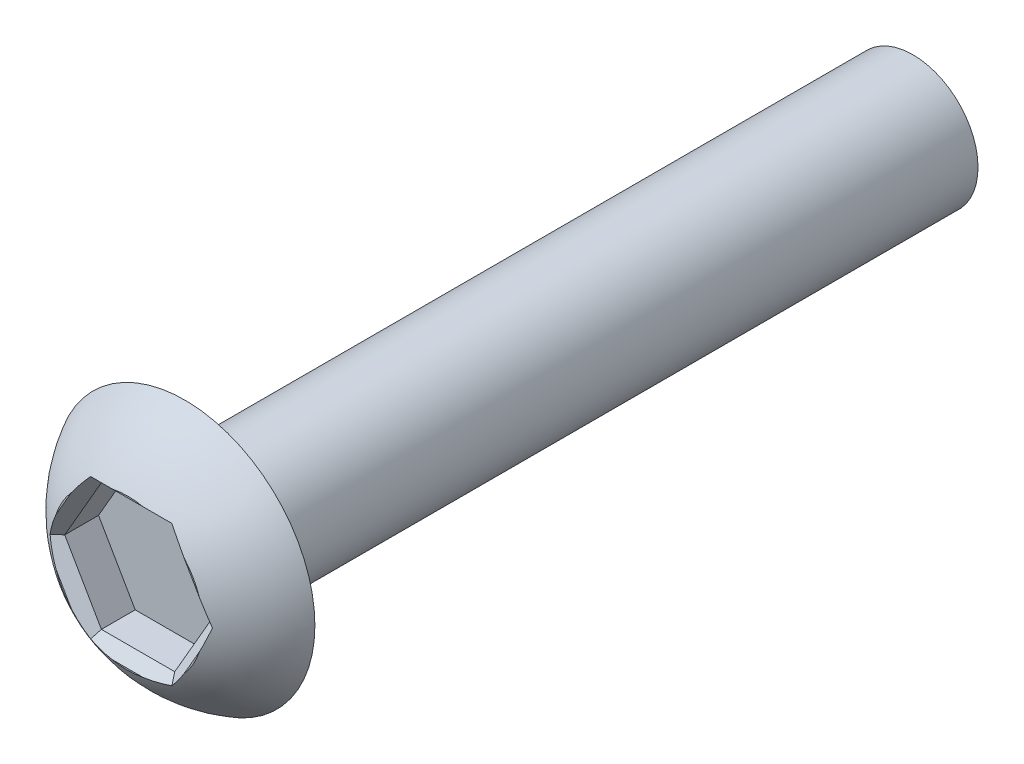
ISO-10303-21;
HEADER;
FILE_DESCRIPTION(('STEP AP214'),'2;1');
FILE_NAME('part.step','',(''),(''),'','','');
FILE_SCHEMA(('AUTOMOTIVE_DESIGN { 1 0 10303 214 1 1 1 1 }'));
ENDSEC;
DATA;
#1=APPLICATION_CONTEXT('core data for automotive mechanical design processes');
#2=APPLICATION_PROTOCOL_DEFINITION('international standard','automotive_design',2000,#1);
#3=PRODUCT_CONTEXT('',#1,'mechanical');
#4=PRODUCT('Part','Part','',(#3));
#5=PRODUCT_RELATED_PRODUCT_CATEGORY('part','',(#4));
#6=PRODUCT_DEFINITION_FORMATION('','',#4);
#7=PRODUCT_DEFINITION_CONTEXT('part definition',#1,'design');
#8=PRODUCT_DEFINITION('design','',#6,#7);
#9=PRODUCT_DEFINITION_SHAPE('','',#8);
#10=(LENGTH_UNIT() NAMED_UNIT(*) SI_UNIT(.MILLI.,.METRE.));
#11=(NAMED_UNIT(*) PLANE_ANGLE_UNIT() SI_UNIT($,.RADIAN.));
#12=(NAMED_UNIT(*) SI_UNIT($,.STERADIAN.) SOLID_ANGLE_UNIT());
#13=UNCERTAINTY_MEASURE_WITH_UNIT(LENGTH_MEASURE(1.E-05),#10,'distance_accuracy_value','');
#14=(GEOMETRIC_REPRESENTATION_CONTEXT(3) GLOBAL_UNCERTAINTY_ASSIGNED_CONTEXT((#13)) GLOBAL_UNIT_ASSIGNED_CONTEXT((#10,
#11,#12)) REPRESENTATION_CONTEXT('',''));
#15=CARTESIAN_POINT('',(0.,0.,0.));
#16=DIRECTION('',(0.,0.,1.));
#17=DIRECTION('',(1.,0.,0.));
#18=AXIS2_PLACEMENT_3D('',#15,#16,#17);
#19=CARTESIAN_POINT('',(-2.5,2.39752736076255,1.1));
#20=DIRECTION('',(0.,0.,-1.));
#21=DIRECTION('',(0.,1.,0.));
#22=AXIS2_PLACEMENT_3D('',#19,#20,#21);
#23=PLANE('',#22);
#24=CARTESIAN_POINT('',(0.,0.,1.1));
#25=DIRECTION('',(0.,0.,-1.));
#26=DIRECTION('',(0.,1.,0.));
#27=AXIS2_PLACEMENT_3D('',#24,#25,#26);
#28=CIRCLE('',#27,1.45143607047182);
#29=CARTESIAN_POINT('',(1.37844449970401,0.454485894063203,1.1));
#30=VERTEX_POINT('',#29);
#31=CARTESIAN_POINT('',(1.08281857977243,0.966525007418989,1.1));
#32=VERTEX_POINT('',#31);
#33=EDGE_CURVE('E300',#30,#32,#28,.F.);
#34=ORIENTED_EDGE('',*,*,#33,.T.);
#35=DIRECTION('',(0.499999999999995,-0.866025403784442,0.));
#36=VECTOR('',#35,1.);
#37=CARTESIAN_POINT('',(1.58310702606532,0.0999999999999991,1.1));
#38=LINE('',#37,#36);
#39=EDGE_CURVE('E218',#32,#30,#38,.T.);
#40=ORIENTED_EDGE('',*,*,#39,.T.);
#41=EDGE_LOOP('',(#34,#40));
#42=FACE_BOUND('',#41,.T.);
#43=ADVANCED_FACE('F45',(#42),#23,.F.);
#44=CARTESIAN_POINT('',(1.08281857977241,-0.966525007419016,1.1));
#45=VERTEX_POINT('',#44);
#46=CARTESIAN_POINT('',(1.37844449970401,-0.454485894063188,1.1));
#47=VERTEX_POINT('',#46);
#48=EDGE_CURVE('E307',#45,#47,#28,.F.);
#49=ORIENTED_EDGE('',*,*,#48,.T.);
#50=DIRECTION('',(-0.500000000000001,-0.866025403784438,0.));
#51=VECTOR('',#50,1.);
#52=CARTESIAN_POINT('',(0.878156053411102,-1.3210109014822,1.1));
#53=LINE('',#52,#51);
#54=EDGE_CURVE('E215',#47,#45,#53,.T.);
#55=ORIENTED_EDGE('',*,*,#54,.T.);
#56=EDGE_LOOP('',(#49,#55));
#57=FACE_BOUND('',#56,.T.);
#58=ADVANCED_FACE('F330',(#57),#23,.F.);
#59=CARTESIAN_POINT('',(-0.295625919931613,-1.4210109014822,1.1));
#60=VERTEX_POINT('',#59);
#61=CARTESIAN_POINT('',(0.295625919931603,-1.4210109014822,1.1));
#62=VERTEX_POINT('',#61);
#63=EDGE_CURVE('E316',#60,#62,#28,.F.);
#64=ORIENTED_EDGE('',*,*,#63,.T.);
#65=DIRECTION('',(-1.,0.,0.));
#66=VECTOR('',#65,1.);
#67=CARTESIAN_POINT('',(-0.704950972654223,-1.4210109014822,1.1));
#68=LINE('',#67,#66);
#69=EDGE_CURVE('E212',#62,#60,#68,.T.);
#70=ORIENTED_EDGE('',*,*,#69,.T.);
#71=EDGE_LOOP('',(#64,#70));
#72=FACE_BOUND('',#71,.T.);
#73=ADVANCED_FACE('F343',(#72),#23,.F.);
#74=CARTESIAN_POINT('',(-1.37844449970402,-0.454485894063174,1.1));
#75=VERTEX_POINT('',#74);
#76=CARTESIAN_POINT('',(-1.08281857977241,-0.966525007419011,1.1));
#77=VERTEX_POINT('',#76);
#78=EDGE_CURVE('E310',#75,#77,#28,.F.);
#79=ORIENTED_EDGE('',*,*,#78,.T.);
#80=DIRECTION('',(-0.499999999999995,0.866025403784442,0.));
#81=VECTOR('',#80,1.);
#82=CARTESIAN_POINT('',(-1.58310702606532,-0.0999999999999886,1.1));
#83=LINE('',#82,#81);
#84=EDGE_CURVE('E209',#77,#75,#83,.T.);
#85=ORIENTED_EDGE('',*,*,#84,.T.);
#86=EDGE_LOOP('',(#79,#85));
#87=FACE_BOUND('',#86,.T.);
#88=ADVANCED_FACE('F348',(#87),#23,.F.);
#89=CARTESIAN_POINT('',(0.295625919931623,1.4210109014822,1.1));
#90=VERTEX_POINT('',#89);
#91=CARTESIAN_POINT('',(-0.295625919931593,1.4210109014822,1.1));
#92=VERTEX_POINT('',#91);
#93=EDGE_CURVE('E294',#90,#92,#28,.F.);
#94=ORIENTED_EDGE('',*,*,#93,.T.);
#95=DIRECTION('',(1.,0.,0.));
#96=VECTOR('',#95,1.);
#97=CARTESIAN_POINT('',(0.704950972654233,1.42101090148219,1.1));
#98=LINE('',#97,#96);
#99=EDGE_CURVE('E206',#92,#90,#98,.T.);
#100=ORIENTED_EDGE('',*,*,#99,.T.);
#101=EDGE_LOOP('',(#94,#100));
#102=FACE_BOUND('',#101,.T.);
#103=ADVANCED_FACE('F358',(#102),#23,.F.);
#104=CARTESIAN_POINT('',(0.,0.,-1.33333333333333));
#105=DIRECTION('',(0.,0.,1.));
#106=DIRECTION('',(0.,-1.,0.));
#107=AXIS2_PLACEMENT_3D('',#104,#105,#106);
#108=SPHERICAL_SURFACE('',#107,2.83333333333333);
#109=ORIENTED_EDGE('',*,*,#33,.F.);
#110=CARTESIAN_POINT('',(-0.438348471401959,-0.253080607962779,-0.827172117407773));
#111=DIRECTION('',(-0.612372435695797,-0.353553390593271,0.707106781186547));
#112=DIRECTION('',(0.755928946018453,0.,0.654653670707979));
#113=AXIS2_PLACEMENT_3D('',#110,#111,#112);
#114=CIRCLE('',#113,2.74141923549889);
#115=CARTESIAN_POINT('',(1.56123159166266,0.,1.03105531808848));
#116=VERTEX_POINT('',#115);
#117=EDGE_CURVE('E255',#30,#116,#114,.F.);
#118=ORIENTED_EDGE('',*,*,#117,.T.);
#119=CARTESIAN_POINT('',(-0.438348471401959,0.253080607962783,-0.827172117407771));
#120=DIRECTION('',(-0.612372435695795,0.353553390593275,0.707106781186547));
#121=DIRECTION('',(0.755928946018454,0.,0.654653670707978));
#122=AXIS2_PLACEMENT_3D('',#119,#120,#121);
#123=CIRCLE('',#122,2.74141923549888);
#124=EDGE_CURVE('E252',#116,#47,#123,.F.);
#125=ORIENTED_EDGE('',*,*,#124,.T.);
#126=ORIENTED_EDGE('',*,*,#48,.F.);
#127=CARTESIAN_POINT('',(-0.438348471401959,0.253080607962783,-0.827172117407771));
#128=DIRECTION('',(-0.612372435695795,0.353553390593275,0.707106781186547));
#129=DIRECTION('',(0.755928946018454,0.,0.654653670707978));
#130=AXIS2_PLACEMENT_3D('',#127,#128,#129);
#131=CIRCLE('',#130,2.74141923549888);
#132=CARTESIAN_POINT('',(0.780615795831329,-1.35206621957068,1.03105531808848));
#133=VERTEX_POINT('',#132);
#134=EDGE_CURVE('E249',#45,#133,#131,.F.);
#135=ORIENTED_EDGE('',*,*,#134,.T.);
#136=CARTESIAN_POINT('',(0.,0.506161215925563,-0.827172117407774));
#137=DIRECTION('',(0.,0.707106781186549,0.707106781186546));
#138=DIRECTION('',(0.,-0.707106781186546,0.707106781186549));
#139=AXIS2_PLACEMENT_3D('',#136,#137,#138);
#140=CIRCLE('',#139,2.74141923549889);
#141=EDGE_CURVE('E246',#133,#62,#140,.F.);
#142=ORIENTED_EDGE('',*,*,#141,.T.);
#143=ORIENTED_EDGE('',*,*,#63,.F.);
#144=CARTESIAN_POINT('',(0.,0.506161215925563,-0.827172117407774));
#145=DIRECTION('',(0.,0.707106781186549,0.707106781186546));
#146=DIRECTION('',(0.,-0.707106781186546,0.707106781186549));
#147=AXIS2_PLACEMENT_3D('',#144,#145,#146);
#148=CIRCLE('',#147,2.74141923549889);
#149=CARTESIAN_POINT('',(-0.780615795831337,-1.35206621957068,1.03105531808848));
#150=VERTEX_POINT('',#149);
#151=EDGE_CURVE('E243',#60,#150,#148,.F.);
#152=ORIENTED_EDGE('',*,*,#151,.T.);
#153=CARTESIAN_POINT('',(0.43834847140196,0.253080607962779,-0.827172117407774));
#154=DIRECTION('',(0.612372435695798,0.353553390593271,0.707106781186546));
#155=DIRECTION('',(0.755928946018452,0.,-0.65465367070798));
#156=AXIS2_PLACEMENT_3D('',#153,#154,#155);
#157=CIRCLE('',#156,2.74141923549889);
#158=EDGE_CURVE('E240',#150,#77,#157,.F.);
#159=ORIENTED_EDGE('',*,*,#158,.T.);
#160=ORIENTED_EDGE('',*,*,#78,.F.);
#161=CARTESIAN_POINT('',(0.43834847140196,0.253080607962779,-0.827172117407774));
#162=DIRECTION('',(0.612372435695798,0.353553390593271,0.707106781186546));
#163=DIRECTION('',(0.755928946018452,0.,-0.65465367070798));
#164=AXIS2_PLACEMENT_3D('',#161,#162,#163);
#165=CIRCLE('',#164,2.74141923549889);
#166=CARTESIAN_POINT('',(-1.56123159166266,0.,1.03105531808848));
#167=VERTEX_POINT('',#166);
#168=EDGE_CURVE('E225',#75,#167,#165,.F.);
#169=ORIENTED_EDGE('',*,*,#168,.T.);
#170=CARTESIAN_POINT('',(0.438348471401957,-0.253080607962785,-0.827172117407772));
#171=DIRECTION('',(0.612372435695793,-0.353553390593279,0.707106781186546));
#172=DIRECTION('',(0.755928946018455,0.,-0.654653670707977));
#173=AXIS2_PLACEMENT_3D('',#170,#171,#172);
#174=CIRCLE('',#173,2.74141923549889);
#175=CARTESIAN_POINT('',(-1.37844449970401,0.454485894063196,1.1));
#176=VERTEX_POINT('',#175);
#177=EDGE_CURVE('E222',#167,#176,#174,.F.);
#178=ORIENTED_EDGE('',*,*,#177,.T.);
#179=CARTESIAN_POINT('',(-1.0828185797724,0.966525007419025,1.1));
#180=VERTEX_POINT('',#179);
#181=EDGE_CURVE('E178',#180,#176,#28,.F.);
#182=ORIENTED_EDGE('',*,*,#181,.F.);
#183=CARTESIAN_POINT('',(0.438348471401957,-0.253080607962785,-0.827172117407772));
#184=DIRECTION('',(0.612372435695793,-0.353553390593279,0.707106781186546));
#185=DIRECTION('',(0.755928946018455,0.,-0.654653670707977));
#186=AXIS2_PLACEMENT_3D('',#183,#184,#185);
#187=CIRCLE('',#186,2.74141923549889);
#188=CARTESIAN_POINT('',(-0.780615795831319,1.35206621957069,1.03105531808848));
#189=VERTEX_POINT('',#188);
#190=EDGE_CURVE('E228',#180,#189,#187,.F.);
#191=ORIENTED_EDGE('',*,*,#190,.T.);
#192=CARTESIAN_POINT('',(0.,-0.506161215925563,-0.827172117407774));
#193=DIRECTION('',(0.,-0.707106781186549,0.707106781186546));
#194=DIRECTION('',(0.,-0.707106781186546,-0.707106781186549));
#195=AXIS2_PLACEMENT_3D('',#192,#193,#194);
#196=CIRCLE('',#195,2.74141923549889);
#197=EDGE_CURVE('E231',#189,#92,#196,.F.);
#198=ORIENTED_EDGE('',*,*,#197,.T.);
#199=ORIENTED_EDGE('',*,*,#93,.F.);
#200=CARTESIAN_POINT('',(0.,-0.506161215925563,-0.827172117407774));
#201=DIRECTION('',(0.,-0.707106781186549,0.707106781186546));
#202=DIRECTION('',(0.,-0.707106781186546,-0.707106781186549));
#203=AXIS2_PLACEMENT_3D('',#200,#201,#202);
#204=CIRCLE('',#203,2.74141923549889);
#205=CARTESIAN_POINT('',(0.780615795831347,1.35206621957067,1.03105531808848));
#206=VERTEX_POINT('',#205);
#207=EDGE_CURVE('E234',#90,#206,#204,.F.);
#208=ORIENTED_EDGE('',*,*,#207,.T.);
#209=CARTESIAN_POINT('',(-0.438348471401959,-0.253080607962779,-0.827172117407773));
#210=DIRECTION('',(-0.612372435695797,-0.353553390593271,0.707106781186547));
#211=DIRECTION('',(0.755928946018453,0.,0.654653670707979));
#212=AXIS2_PLACEMENT_3D('',#209,#210,#211);
#213=CIRCLE('',#212,2.74141923549889);
#214=EDGE_CURVE('E237',#206,#32,#213,.F.);
#215=ORIENTED_EDGE('',*,*,#214,.T.);
#216=EDGE_LOOP('',(#109,#118,#125,#126,#135,#142,#143,#152,#159,#160,#169,#178,#182,#191,#198,
#199,#208,#215));
#217=FACE_BOUND('',#216,.T.);
#218=CARTESIAN_POINT('',(0.,0.,0.));
#219=DIRECTION('',(0.,0.,1.));
#220=DIRECTION('',(1.,0.,0.));
#221=AXIS2_PLACEMENT_3D('',#218,#219,#220);
#222=CIRCLE('',#221,2.5);
#223=CARTESIAN_POINT('',(2.5,0.,0.));
#224=VERTEX_POINT('',#223);
#225=EDGE_CURVE('E184',#224,#224,#222,.T.);
#226=ORIENTED_EDGE('',*,*,#225,.T.);
#227=EDGE_LOOP('',(#226));
#228=FACE_BOUND('',#227,.T.);
#229=ADVANCED_FACE('F340',(#217,#228),#108,.T.);
#230=CARTESIAN_POINT('',(0.,0.,-14.));
#231=DIRECTION('',(0.,0.,1.));
#232=DIRECTION('',(1.,0.,0.));
#233=AXIS2_PLACEMENT_3D('',#230,#231,#232);
#234=CYLINDRICAL_SURFACE('',#233,1.25);
#235=CARTESIAN_POINT('',(0.,0.,-14.));
#236=DIRECTION('',(0.,0.,1.));
#237=DIRECTION('',(1.,0.,0.));
#238=AXIS2_PLACEMENT_3D('',#235,#236,#237);
#239=CIRCLE('',#238,1.25);
#240=CARTESIAN_POINT('',(1.25,0.,-14.));
#241=VERTEX_POINT('',#240);
#242=EDGE_CURVE('E196',#241,#241,#239,.T.);
#243=ORIENTED_EDGE('',*,*,#242,.T.);
#244=EDGE_LOOP('',(#243));
#245=FACE_BOUND('',#244,.T.);
#246=CARTESIAN_POINT('',(0.,0.,0.));
#247=DIRECTION('',(0.,0.,1.));
#248=DIRECTION('',(1.,0.,0.));
#249=AXIS2_PLACEMENT_3D('',#246,#247,#248);
#250=CIRCLE('',#249,1.25);
#251=CARTESIAN_POINT('',(1.25,0.,0.));
#252=VERTEX_POINT('',#251);
#253=EDGE_CURVE('E190',#252,#252,#250,.T.);
#254=ORIENTED_EDGE('',*,*,#253,.F.);
#255=EDGE_LOOP('',(#254));
#256=FACE_BOUND('',#255,.T.);
#257=ADVANCED_FACE('F385',(#245,#256),#234,.T.);
#258=CARTESIAN_POINT('',(0.,0.,-14.));
#259=DIRECTION('',(0.,0.,1.));
#260=DIRECTION('',(1.,0.,0.));
#261=AXIS2_PLACEMENT_3D('',#258,#259,#260);
#262=PLANE('',#261);
#263=ORIENTED_EDGE('',*,*,#242,.F.);
#264=EDGE_LOOP('',(#263));
#265=FACE_BOUND('',#264,.T.);
#266=ADVANCED_FACE('F377',(#265),#262,.F.);
#267=CARTESIAN_POINT('',(0.,0.,0.));
#268=DIRECTION('',(0.,0.,1.));
#269=DIRECTION('',(1.,0.,0.));
#270=AXIS2_PLACEMENT_3D('',#267,#268,#269);
#271=PLANE('',#270);
#272=ORIENTED_EDGE('',*,*,#253,.T.);
#273=EDGE_LOOP('',(#272));
#274=FACE_BOUND('',#273,.T.);
#275=ORIENTED_EDGE('',*,*,#225,.F.);
#276=EDGE_LOOP('',(#275));
#277=FACE_BOUND('',#276,.T.);
#278=ADVANCED_FACE('F371',(#274,#277),#271,.F.);
#279=ORIENTED_EDGE('',*,*,#181,.T.);
#280=DIRECTION('',(0.500000000000007,0.866025403784435,0.));
#281=VECTOR('',#280,1.);
#282=CARTESIAN_POINT('',(-0.878156053411092,1.32101090148221,1.1));
#283=LINE('',#282,#281);
#284=EDGE_CURVE('E200',#176,#180,#283,.T.);
#285=ORIENTED_EDGE('',*,*,#284,.T.);
#286=EDGE_LOOP('',(#279,#285));
#287=FACE_BOUND('',#286,.T.);
#288=ADVANCED_FACE('F352',(#287),#23,.F.);
#289=CARTESIAN_POINT('',(0.,0.,0.25));
#290=DIRECTION('',(0.,0.,-1.));
#291=DIRECTION('',(-1.,0.,0.));
#292=AXIS2_PLACEMENT_3D('',#289,#290,#291);
#293=PLANE('',#292);
#294=DIRECTION('',(0.499999999999995,-0.866025403784441,0.));
#295=VECTOR('',#294,1.);
#296=CARTESIAN_POINT('',(0.704950972654231,1.22101090148219,0.25));
#297=LINE('',#296,#295);
#298=CARTESIAN_POINT('',(0.704950972654231,1.22101090148219,0.25));
#299=VERTEX_POINT('',#298);
#300=CARTESIAN_POINT('',(1.40990194530843,0.,0.25));
#301=VERTEX_POINT('',#300);
#302=EDGE_CURVE('E160',#299,#301,#297,.T.);
#303=ORIENTED_EDGE('',*,*,#302,.F.);
#304=DIRECTION('',(1.,0.,0.));
#305=VECTOR('',#304,1.);
#306=CARTESIAN_POINT('',(-0.704950972654205,1.22101090148221,0.25));
#307=LINE('',#306,#305);
#308=CARTESIAN_POINT('',(-0.704950972654205,1.22101090148221,0.25));
#309=VERTEX_POINT('',#308);
#310=EDGE_CURVE('E574',#309,#299,#307,.T.);
#311=ORIENTED_EDGE('',*,*,#310,.F.);
#312=DIRECTION('',(0.500000000000007,0.866025403784434,0.));
#313=VECTOR('',#312,1.);
#314=CARTESIAN_POINT('',(-1.40990194530843,0.,0.25));
#315=LINE('',#314,#313);
#316=CARTESIAN_POINT('',(-1.40990194530843,0.,0.25));
#317=VERTEX_POINT('',#316);
#318=EDGE_CURVE('E577',#317,#309,#315,.T.);
#319=ORIENTED_EDGE('',*,*,#318,.F.);
#320=DIRECTION('',(-0.499999999999995,0.866025403784442,0.));
#321=VECTOR('',#320,1.);
#322=CARTESIAN_POINT('',(-0.704950972654223,-1.2210109014822,0.25));
#323=LINE('',#322,#321);
#324=CARTESIAN_POINT('',(-0.704950972654223,-1.2210109014822,0.25));
#325=VERTEX_POINT('',#324);
#326=EDGE_CURVE('E580',#325,#317,#323,.T.);
#327=ORIENTED_EDGE('',*,*,#326,.F.);
#328=DIRECTION('',(-1.,0.,0.));
#329=VECTOR('',#328,1.);
#330=CARTESIAN_POINT('',(0.704950972654214,-1.2210109014822,0.25));
#331=LINE('',#330,#329);
#332=CARTESIAN_POINT('',(0.704950972654214,-1.2210109014822,0.25));
#333=VERTEX_POINT('',#332);
#334=EDGE_CURVE('E162',#333,#325,#331,.T.);
#335=ORIENTED_EDGE('',*,*,#334,.F.);
#336=DIRECTION('',(-0.500000000000001,-0.866025403784438,0.));
#337=VECTOR('',#336,1.);
#338=CARTESIAN_POINT('',(1.40990194530843,0.,0.25));
#339=LINE('',#338,#337);
#340=EDGE_CURVE('E156',#301,#333,#339,.T.);
#341=ORIENTED_EDGE('',*,*,#340,.F.);
#342=EDGE_LOOP('',(#303,#311,#319,#327,#335,#341));
#343=FACE_BOUND('',#342,.T.);
#344=ADVANCED_FACE('F158',(#343),#293,.F.);
#345=CARTESIAN_POINT('',(-0.704950972654205,1.22101090148221,0.25));
#346=DIRECTION('',(0.,-1.,0.));
#347=DIRECTION('',(1.,0.,0.));
#348=AXIS2_PLACEMENT_3D('',#345,#346,#347);
#349=PLANE('',#348);
#350=DIRECTION('',(0.,0.,1.));
#351=VECTOR('',#350,1.);
#352=CARTESIAN_POINT('',(0.704950972654231,1.22101090148219,0.25));
#353=LINE('',#352,#351);
#354=CARTESIAN_POINT('',(0.704950972654231,1.22101090148219,0.9));
#355=VERTEX_POINT('',#354);
#356=EDGE_CURVE('E176',#299,#355,#353,.T.);
#357=ORIENTED_EDGE('',*,*,#356,.T.);
#358=DIRECTION('',(-1.,0.,0.));
#359=VECTOR('',#358,1.);
#360=CARTESIAN_POINT('',(-0.704950972654205,1.22101090148221,0.9));
#361=LINE('',#360,#359);
#362=CARTESIAN_POINT('',(-0.704950972654205,1.22101090148221,0.9));
#363=VERTEX_POINT('',#362);
#364=EDGE_CURVE('E56',#355,#363,#361,.T.);
#365=ORIENTED_EDGE('',*,*,#364,.T.);
#366=DIRECTION('',(0.,0.,1.));
#367=VECTOR('',#366,1.);
#368=CARTESIAN_POINT('',(-0.704950972654205,1.22101090148221,0.25));
#369=LINE('',#368,#367);
#370=EDGE_CURVE('E567',#309,#363,#369,.T.);
#371=ORIENTED_EDGE('',*,*,#370,.F.);
#372=ORIENTED_EDGE('',*,*,#310,.T.);
#373=EDGE_LOOP('',(#357,#365,#371,#372));
#374=FACE_BOUND('',#373,.T.);
#375=ADVANCED_FACE('F376',(#374),#349,.T.);
#376=CARTESIAN_POINT('',(-1.40990194530843,0.,0.25));
#377=DIRECTION('',(0.866025403784435,-0.500000000000007,0.));
#378=DIRECTION('',(0.500000000000007,0.866025403784435,0.));
#379=AXIS2_PLACEMENT_3D('',#376,#377,#378);
#380=PLANE('',#379);
#381=ORIENTED_EDGE('',*,*,#370,.T.);
#382=DIRECTION('',(-0.500000000000007,-0.866025403784435,0.));
#383=VECTOR('',#382,1.);
#384=CARTESIAN_POINT('',(-1.40990194530843,0.,0.9));
#385=LINE('',#384,#383);
#386=CARTESIAN_POINT('',(-1.40990194530843,0.,0.9));
#387=VERTEX_POINT('',#386);
#388=EDGE_CURVE('E11',#363,#387,#385,.T.);
#389=ORIENTED_EDGE('',*,*,#388,.T.);
#390=DIRECTION('',(0.,0.,1.));
#391=VECTOR('',#390,1.);
#392=CARTESIAN_POINT('',(-1.40990194530843,0.,0.25));
#393=LINE('',#392,#391);
#394=EDGE_CURVE('E565',#317,#387,#393,.T.);
#395=ORIENTED_EDGE('',*,*,#394,.F.);
#396=ORIENTED_EDGE('',*,*,#318,.T.);
#397=EDGE_LOOP('',(#381,#389,#395,#396));
#398=FACE_BOUND('',#397,.T.);
#399=ADVANCED_FACE('F453',(#398),#380,.T.);
#400=CARTESIAN_POINT('',(-0.704950972654223,-1.2210109014822,0.25));
#401=DIRECTION('',(0.866025403784442,0.499999999999995,0.));
#402=DIRECTION('',(-0.499999999999995,0.866025403784442,0.));
#403=AXIS2_PLACEMENT_3D('',#400,#401,#402);
#404=PLANE('',#403);
#405=ORIENTED_EDGE('',*,*,#394,.T.);
#406=DIRECTION('',(0.499999999999995,-0.866025403784442,0.));
#407=VECTOR('',#406,1.);
#408=CARTESIAN_POINT('',(-0.704950972654223,-1.2210109014822,0.899999999999999));
#409=LINE('',#408,#407);
#410=CARTESIAN_POINT('',(-0.704950972654223,-1.2210109014822,0.899999999999999));
#411=VERTEX_POINT('',#410);
#412=EDGE_CURVE('E266',#387,#411,#409,.T.);
#413=ORIENTED_EDGE('',*,*,#412,.T.);
#414=DIRECTION('',(0.,0.,1.));
#415=VECTOR('',#414,1.);
#416=CARTESIAN_POINT('',(-0.704950972654223,-1.2210109014822,0.25));
#417=LINE('',#416,#415);
#418=EDGE_CURVE('E192',#325,#411,#417,.T.);
#419=ORIENTED_EDGE('',*,*,#418,.F.);
#420=ORIENTED_EDGE('',*,*,#326,.T.);
#421=EDGE_LOOP('',(#405,#413,#419,#420));
#422=FACE_BOUND('',#421,.T.);
#423=ADVANCED_FACE('F462',(#422),#404,.T.);
#424=CARTESIAN_POINT('',(0.704950972654214,-1.2210109014822,0.25));
#425=DIRECTION('',(0.,1.,0.));
#426=DIRECTION('',(-1.,0.,0.));
#427=AXIS2_PLACEMENT_3D('',#424,#425,#426);
#428=PLANE('',#427);
#429=ORIENTED_EDGE('',*,*,#418,.T.);
#430=DIRECTION('',(1.,0.,0.));
#431=VECTOR('',#430,1.);
#432=CARTESIAN_POINT('',(0.704950972654214,-1.2210109014822,0.899999999999999));
#433=LINE('',#432,#431);
#434=CARTESIAN_POINT('',(0.704950972654214,-1.2210109014822,0.899999999999999));
#435=VERTEX_POINT('',#434);
#436=EDGE_CURVE('E263',#411,#435,#433,.T.);
#437=ORIENTED_EDGE('',*,*,#436,.T.);
#438=DIRECTION('',(0.,0.,1.));
#439=VECTOR('',#438,1.);
#440=CARTESIAN_POINT('',(0.704950972654214,-1.2210109014822,0.25));
#441=LINE('',#440,#439);
#442=EDGE_CURVE('E185',#333,#435,#441,.T.);
#443=ORIENTED_EDGE('',*,*,#442,.F.);
#444=ORIENTED_EDGE('',*,*,#334,.T.);
#445=EDGE_LOOP('',(#429,#437,#443,#444));
#446=FACE_BOUND('',#445,.T.);
#447=ADVANCED_FACE('F471',(#446),#428,.T.);
#448=CARTESIAN_POINT('',(1.40990194530843,0.,0.25));
#449=DIRECTION('',(-0.866025403784438,0.500000000000001,0.));
#450=DIRECTION('',(-0.500000000000001,-0.866025403784438,0.));
#451=AXIS2_PLACEMENT_3D('',#448,#449,#450);
#452=PLANE('',#451);
#453=ORIENTED_EDGE('',*,*,#442,.T.);
#454=DIRECTION('',(0.500000000000001,0.866025403784438,0.));
#455=VECTOR('',#454,1.);
#456=CARTESIAN_POINT('',(1.40990194530843,0.,0.9));
#457=LINE('',#456,#455);
#458=CARTESIAN_POINT('',(1.40990194530843,0.,0.9));
#459=VERTEX_POINT('',#458);
#460=EDGE_CURVE('E182',#435,#459,#457,.T.);
#461=ORIENTED_EDGE('',*,*,#460,.T.);
#462=DIRECTION('',(0.,0.,1.));
#463=VECTOR('',#462,1.);
#464=CARTESIAN_POINT('',(1.40990194530843,0.,0.25));
#465=LINE('',#464,#463);
#466=EDGE_CURVE('E174',#301,#459,#465,.T.);
#467=ORIENTED_EDGE('',*,*,#466,.F.);
#468=ORIENTED_EDGE('',*,*,#340,.T.);
#469=EDGE_LOOP('',(#453,#461,#467,#468));
#470=FACE_BOUND('',#469,.T.);
#471=ADVANCED_FACE('F180',(#470),#452,.T.);
#472=CARTESIAN_POINT('',(0.704950972654231,1.22101090148219,0.25));
#473=DIRECTION('',(-0.866025403784442,-0.499999999999995,0.));
#474=DIRECTION('',(0.499999999999995,-0.866025403784442,0.));
#475=AXIS2_PLACEMENT_3D('',#472,#473,#474);
#476=PLANE('',#475);
#477=ORIENTED_EDGE('',*,*,#466,.T.);
#478=DIRECTION('',(-0.499999999999995,0.866025403784442,0.));
#479=VECTOR('',#478,1.);
#480=CARTESIAN_POINT('',(0.704950972654231,1.22101090148219,0.9));
#481=LINE('',#480,#479);
#482=EDGE_CURVE('E258',#459,#355,#481,.T.);
#483=ORIENTED_EDGE('',*,*,#482,.T.);
#484=ORIENTED_EDGE('',*,*,#356,.F.);
#485=ORIENTED_EDGE('',*,*,#302,.T.);
#486=EDGE_LOOP('',(#477,#483,#484,#485));
#487=FACE_BOUND('',#486,.T.);
#488=ADVANCED_FACE('F172',(#487),#476,.T.);
#489=CARTESIAN_POINT('',(-2.89379134008251,2.17017182456138,1.1));
#490=DIRECTION('',(0.612372435695798,0.353553390593271,0.707106781186546));
#491=DIRECTION('',(0.499999999999995,-0.866025403784442,0.));
#492=AXIS2_PLACEMENT_3D('',#489,#490,#491);
#493=PLANE('',#492);
#494=DIRECTION('',(-0.377964473009229,-0.654653670707974,0.654653670707979));
#495=VECTOR('',#494,1.);
#496=CARTESIAN_POINT('',(-0.228029508323463,-0.394958694041184,0.0739477925589787));
#497=LINE('',#496,#495);
#498=EDGE_CURVE('E285',#411,#150,#497,.T.);
#499=ORIENTED_EDGE('',*,*,#498,.F.);
#500=ORIENTED_EDGE('',*,*,#412,.F.);
#501=DIRECTION('',(-0.755928946018453,0.,0.654653670707979));
#502=VECTOR('',#501,1.);
#503=CARTESIAN_POINT('',(-1.17034473093264,0.,0.69253736669073));
#504=LINE('',#503,#502);
#505=EDGE_CURVE('E50',#167,#387,#504,.F.);
#506=ORIENTED_EDGE('',*,*,#505,.F.);
#507=ORIENTED_EDGE('',*,*,#168,.F.);
#508=ORIENTED_EDGE('',*,*,#84,.F.);
#509=ORIENTED_EDGE('',*,*,#158,.F.);
#510=EDGE_LOOP('',(#499,#500,#506,#507,#508,#509));
#511=FACE_BOUND('',#510,.T.);
#512=ADVANCED_FACE('F48',(#511),#493,.T.);
#513=CARTESIAN_POINT('',(-0.817471739393899,1.42611921658245,1.1));
#514=DIRECTION('',(0.612372435695793,-0.353553390593279,0.707106781186546));
#515=DIRECTION('',(-0.500000000000007,-0.866025403784435,0.));
#516=AXIS2_PLACEMENT_3D('',#513,#514,#515);
#517=PLANE('',#516);
#518=ORIENTED_EDGE('',*,*,#505,.T.);
#519=ORIENTED_EDGE('',*,*,#388,.F.);
#520=DIRECTION('',(0.377964473009221,-0.654653670707979,-0.654653670707979));
#521=VECTOR('',#520,1.);
#522=CARTESIAN_POINT('',(-0.821263679948766,1.42247042008228,1.10145951860007));
#523=LINE('',#522,#521);
#524=EDGE_CURVE('E282',#189,#363,#523,.T.);
#525=ORIENTED_EDGE('',*,*,#524,.F.);
#526=ORIENTED_EDGE('',*,*,#190,.F.);
#527=ORIENTED_EDGE('',*,*,#284,.F.);
#528=ORIENTED_EDGE('',*,*,#177,.F.);
#529=EDGE_LOOP('',(#518,#519,#525,#526,#527,#528));
#530=FACE_BOUND('',#529,.T.);
#531=ADVANCED_FACE('F349',(#530),#517,.T.);
#532=CARTESIAN_POINT('',(-2.50000000000001,-1.42101090148219,1.1));
#533=DIRECTION('',(0.,0.707106781186549,0.707106781186546));
#534=DIRECTION('',(1.,0.,0.));
#535=AXIS2_PLACEMENT_3D('',#532,#533,#534);
#536=PLANE('',#535);
#537=ORIENTED_EDGE('',*,*,#69,.F.);
#538=ORIENTED_EDGE('',*,*,#141,.F.);
#539=DIRECTION('',(0.377964473009227,-0.654653670707976,0.654653670707978));
#540=VECTOR('',#539,1.);
#541=CARTESIAN_POINT('',(0.346075165564687,-0.599419769995855,0.27840886851365));
#542=LINE('',#541,#540);
#543=EDGE_CURVE('E278',#435,#133,#542,.T.);
#544=ORIENTED_EDGE('',*,*,#543,.F.);
#545=ORIENTED_EDGE('',*,*,#436,.F.);
#546=ORIENTED_EDGE('',*,*,#498,.T.);
#547=ORIENTED_EDGE('',*,*,#151,.F.);
#548=EDGE_LOOP('',(#537,#538,#544,#545,#546,#547));
#549=FACE_BOUND('',#548,.T.);
#550=ADVANCED_FACE('F342',(#549),#536,.T.);
#551=CARTESIAN_POINT('',(-2.50000000000001,1.42101090148223,1.1));
#552=DIRECTION('',(0.,-0.707106781186549,0.707106781186546));
#553=DIRECTION('',(-1.,0.,0.));
#554=AXIS2_PLACEMENT_3D('',#551,#552,#553);
#555=PLANE('',#554);
#556=ORIENTED_EDGE('',*,*,#524,.T.);
#557=ORIENTED_EDGE('',*,*,#364,.F.);
#558=DIRECTION('',(-0.377964473009233,-0.654653670707972,-0.654653670707979));
#559=VECTOR('',#558,1.);
#560=CARTESIAN_POINT('',(0.346075165564699,0.599419769995852,0.278408868513651));
#561=LINE('',#560,#559);
#562=EDGE_CURVE('E275',#206,#355,#561,.T.);
#563=ORIENTED_EDGE('',*,*,#562,.F.);
#564=ORIENTED_EDGE('',*,*,#207,.F.);
#565=ORIENTED_EDGE('',*,*,#99,.F.);
#566=ORIENTED_EDGE('',*,*,#197,.F.);
#567=EDGE_LOOP('',(#556,#557,#563,#564,#565,#566));
#568=FACE_BOUND('',#567,.T.);
#569=ADVANCED_FACE('F355',(#568),#555,.T.);
#570=CARTESIAN_POINT('',(1.64379134008253,0.00510831510026075,1.1));
#571=DIRECTION('',(-0.612372435695795,0.353553390593275,0.707106781186547));
#572=DIRECTION('',(0.500000000000001,0.866025403784438,0.));
#573=AXIS2_PLACEMENT_3D('',#570,#571,#572);
#574=PLANE('',#573);
#575=ORIENTED_EDGE('',*,*,#54,.F.);
#576=ORIENTED_EDGE('',*,*,#124,.F.);
#577=DIRECTION('',(0.755928946018453,0.,0.654653670707978));
#578=VECTOR('',#577,1.);
#579=CARTESIAN_POINT('',(1.64252735989756,0.,1.10145951860007));
#580=LINE('',#579,#578);
#581=EDGE_CURVE('E271',#459,#116,#580,.T.);
#582=ORIENTED_EDGE('',*,*,#581,.F.);
#583=ORIENTED_EDGE('',*,*,#460,.F.);
#584=ORIENTED_EDGE('',*,*,#543,.T.);
#585=ORIENTED_EDGE('',*,*,#134,.F.);
#586=EDGE_LOOP('',(#575,#576,#582,#583,#584,#585));
#587=FACE_BOUND('',#586,.T.);
#588=ADVANCED_FACE('F335',(#587),#574,.T.);
#589=CARTESIAN_POINT('',(-0.432528260606074,3.59118272604356,1.1));
#590=DIRECTION('',(-0.612372435695797,-0.353553390593271,0.707106781186547));
#591=DIRECTION('',(-0.499999999999995,0.866025403784442,0.));
#592=AXIS2_PLACEMENT_3D('',#589,#590,#591);
#593=PLANE('',#592);
#594=ORIENTED_EDGE('',*,*,#562,.T.);
#595=ORIENTED_EDGE('',*,*,#482,.F.);
#596=ORIENTED_EDGE('',*,*,#581,.T.);
#597=ORIENTED_EDGE('',*,*,#117,.F.);
#598=ORIENTED_EDGE('',*,*,#39,.F.);
#599=ORIENTED_EDGE('',*,*,#214,.F.);
#600=EDGE_LOOP('',(#594,#595,#596,#597,#598,#599));
#601=FACE_BOUND('',#600,.T.);
#602=ADVANCED_FACE('F362',(#601),#593,.T.);
#603=CLOSED_SHELL('',(#43,#58,#73,#88,#103,#229,#257,#266,#278,#288,#344,#375,#399,#423,#447,
#471,#488,#512,#531,#550,#569,#588,#602));
#604=MANIFOLD_SOLID_BREP('B2',#603);
#605=ADVANCED_BREP_SHAPE_REPRESENTATION('',(#18,#604),#14);
#606=SHAPE_DEFINITION_REPRESENTATION(#9,#605);
ENDSEC;
END-ISO-10303-21;
